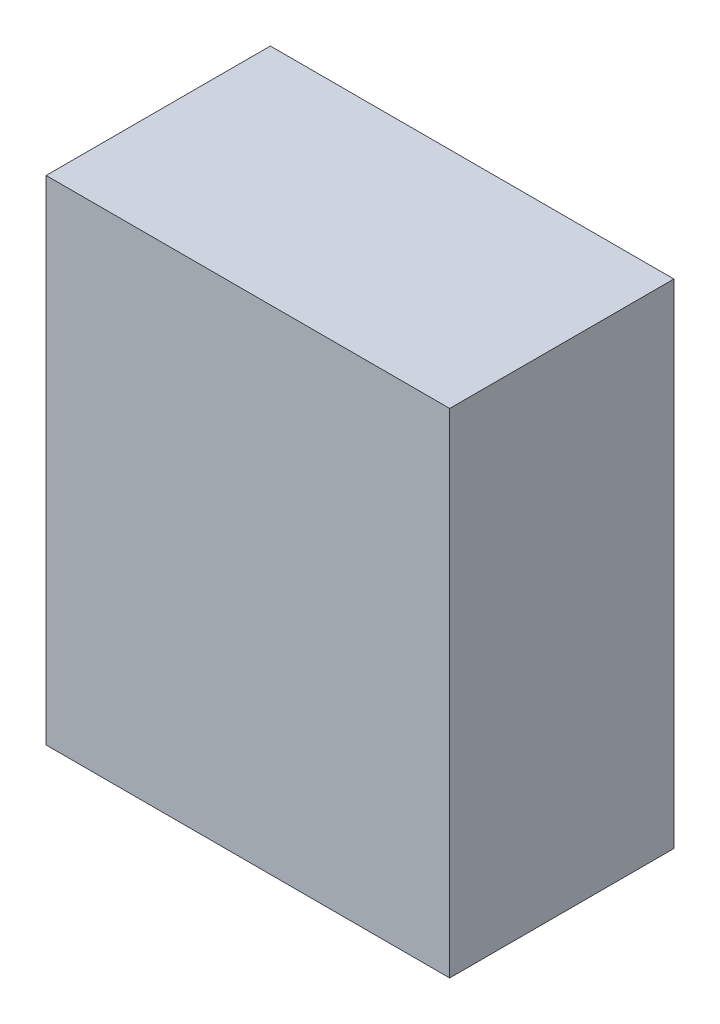
ISO-10303-21;
HEADER;
FILE_DESCRIPTION(('STEP AP214'),'2;1');
FILE_NAME('part.step','',(''),(''),'','','');
FILE_SCHEMA(('AUTOMOTIVE_DESIGN { 1 0 10303 214 1 1 1 1 }'));
ENDSEC;
DATA;
#1=APPLICATION_CONTEXT('core data for automotive mechanical design processes');
#2=APPLICATION_PROTOCOL_DEFINITION('international standard','automotive_design',2000,#1);
#3=PRODUCT_CONTEXT('',#1,'mechanical');
#4=PRODUCT('Part','Part','',(#3));
#5=PRODUCT_RELATED_PRODUCT_CATEGORY('part','',(#4));
#6=PRODUCT_DEFINITION_FORMATION('','',#4);
#7=PRODUCT_DEFINITION_CONTEXT('part definition',#1,'design');
#8=PRODUCT_DEFINITION('design','',#6,#7);
#9=PRODUCT_DEFINITION_SHAPE('','',#8);
#10=(LENGTH_UNIT() NAMED_UNIT(*) SI_UNIT(.MILLI.,.METRE.));
#11=(NAMED_UNIT(*) PLANE_ANGLE_UNIT() SI_UNIT($,.RADIAN.));
#12=(NAMED_UNIT(*) SI_UNIT($,.STERADIAN.) SOLID_ANGLE_UNIT());
#13=UNCERTAINTY_MEASURE_WITH_UNIT(LENGTH_MEASURE(1.E-05),#10,'distance_accuracy_value','');
#14=(GEOMETRIC_REPRESENTATION_CONTEXT(3) GLOBAL_UNCERTAINTY_ASSIGNED_CONTEXT((#13)) GLOBAL_UNIT_ASSIGNED_CONTEXT((#10,
#11,#12)) REPRESENTATION_CONTEXT('',''));
#15=CARTESIAN_POINT('',(0.,0.,0.));
#16=DIRECTION('',(0.,0.,1.));
#17=DIRECTION('',(1.,0.,0.));
#18=AXIS2_PLACEMENT_3D('',#15,#16,#17);
#19=CARTESIAN_POINT('',(-18.,22.,20.));
#20=DIRECTION('',(1.,0.,0.));
#21=DIRECTION('',(0.,1.,0.));
#22=AXIS2_PLACEMENT_3D('',#19,#20,#21);
#23=PLANE('',#22);
#24=DIRECTION('',(0.,-1.,0.));
#25=VECTOR('',#24,1.);
#26=CARTESIAN_POINT('',(-18.,22.,0.));
#27=LINE('',#26,#25);
#28=CARTESIAN_POINT('',(-18.,22.,0.));
#29=VERTEX_POINT('',#28);
#30=CARTESIAN_POINT('',(-18.,-22.,0.));
#31=VERTEX_POINT('',#30);
#32=EDGE_CURVE('E102',#29,#31,#27,.T.);
#33=ORIENTED_EDGE('',*,*,#32,.T.);
#34=DIRECTION('',(0.,0.,-1.));
#35=VECTOR('',#34,1.);
#36=CARTESIAN_POINT('',(-18.,-22.,20.));
#37=LINE('',#36,#35);
#38=CARTESIAN_POINT('',(-18.,-22.,20.));
#39=VERTEX_POINT('',#38);
#40=EDGE_CURVE('E11',#39,#31,#37,.T.);
#41=ORIENTED_EDGE('',*,*,#40,.F.);
#42=DIRECTION('',(0.,-1.,0.));
#43=VECTOR('',#42,1.);
#44=CARTESIAN_POINT('',(-18.,22.,20.));
#45=LINE('',#44,#43);
#46=CARTESIAN_POINT('',(-18.,22.,20.));
#47=VERTEX_POINT('',#46);
#48=EDGE_CURVE('E90',#47,#39,#45,.T.);
#49=ORIENTED_EDGE('',*,*,#48,.F.);
#50=DIRECTION('',(0.,0.,-1.));
#51=VECTOR('',#50,1.);
#52=CARTESIAN_POINT('',(-18.,22.,20.));
#53=LINE('',#52,#51);
#54=EDGE_CURVE('E98',#47,#29,#53,.T.);
#55=ORIENTED_EDGE('',*,*,#54,.T.);
#56=EDGE_LOOP('',(#33,#41,#49,#55));
#57=FACE_BOUND('',#56,.T.);
#58=ADVANCED_FACE('F39',(#57),#23,.F.);
#59=CARTESIAN_POINT('',(-18.,-22.,20.));
#60=DIRECTION('',(0.,1.,0.));
#61=DIRECTION('',(0.,0.,1.));
#62=AXIS2_PLACEMENT_3D('',#59,#60,#61);
#63=PLANE('',#62);
#64=DIRECTION('',(1.,0.,0.));
#65=VECTOR('',#64,1.);
#66=CARTESIAN_POINT('',(-18.,-22.,0.));
#67=LINE('',#66,#65);
#68=CARTESIAN_POINT('',(18.,-22.,0.));
#69=VERTEX_POINT('',#68);
#70=EDGE_CURVE('E94',#31,#69,#67,.T.);
#71=ORIENTED_EDGE('',*,*,#70,.T.);
#72=DIRECTION('',(0.,0.,-1.));
#73=VECTOR('',#72,1.);
#74=CARTESIAN_POINT('',(18.,-22.,20.));
#75=LINE('',#74,#73);
#76=CARTESIAN_POINT('',(18.,-22.,20.));
#77=VERTEX_POINT('',#76);
#78=EDGE_CURVE('E47',#77,#69,#75,.T.);
#79=ORIENTED_EDGE('',*,*,#78,.F.);
#80=DIRECTION('',(1.,0.,0.));
#81=VECTOR('',#80,1.);
#82=CARTESIAN_POINT('',(-18.,-22.,20.));
#83=LINE('',#82,#81);
#84=EDGE_CURVE('E85',#39,#77,#83,.T.);
#85=ORIENTED_EDGE('',*,*,#84,.F.);
#86=ORIENTED_EDGE('',*,*,#40,.T.);
#87=EDGE_LOOP('',(#71,#79,#85,#86));
#88=FACE_BOUND('',#87,.T.);
#89=ADVANCED_FACE('F93',(#88),#63,.F.);
#90=CARTESIAN_POINT('',(18.,22.,20.));
#91=DIRECTION('',(-1.,0.,0.));
#92=DIRECTION('',(0.,-1.,0.));
#93=AXIS2_PLACEMENT_3D('',#90,#91,#92);
#94=PLANE('',#93);
#95=DIRECTION('',(0.,1.,0.));
#96=VECTOR('',#95,1.);
#97=CARTESIAN_POINT('',(18.,22.,0.));
#98=LINE('',#97,#96);
#99=CARTESIAN_POINT('',(18.,22.,0.));
#100=VERTEX_POINT('',#99);
#101=EDGE_CURVE('E72',#69,#100,#98,.T.);
#102=ORIENTED_EDGE('',*,*,#101,.T.);
#103=DIRECTION('',(0.,0.,-1.));
#104=VECTOR('',#103,1.);
#105=CARTESIAN_POINT('',(18.,22.,20.));
#106=LINE('',#105,#104);
#107=CARTESIAN_POINT('',(18.,22.,20.));
#108=VERTEX_POINT('',#107);
#109=EDGE_CURVE('E95',#108,#100,#106,.T.);
#110=ORIENTED_EDGE('',*,*,#109,.F.);
#111=DIRECTION('',(0.,1.,0.));
#112=VECTOR('',#111,1.);
#113=CARTESIAN_POINT('',(18.,22.,20.));
#114=LINE('',#113,#112);
#115=EDGE_CURVE('E88',#77,#108,#114,.T.);
#116=ORIENTED_EDGE('',*,*,#115,.F.);
#117=ORIENTED_EDGE('',*,*,#78,.T.);
#118=EDGE_LOOP('',(#102,#110,#116,#117));
#119=FACE_BOUND('',#118,.T.);
#120=ADVANCED_FACE('F96',(#119),#94,.F.);
#121=CARTESIAN_POINT('',(-18.,22.,20.));
#122=DIRECTION('',(0.,-1.,0.));
#123=DIRECTION('',(0.,0.,-1.));
#124=AXIS2_PLACEMENT_3D('',#121,#122,#123);
#125=PLANE('',#124);
#126=DIRECTION('',(-1.,0.,0.));
#127=VECTOR('',#126,1.);
#128=CARTESIAN_POINT('',(-18.,22.,0.));
#129=LINE('',#128,#127);
#130=EDGE_CURVE('E78',#100,#29,#129,.T.);
#131=ORIENTED_EDGE('',*,*,#130,.T.);
#132=ORIENTED_EDGE('',*,*,#54,.F.);
#133=DIRECTION('',(-1.,0.,0.));
#134=VECTOR('',#133,1.);
#135=CARTESIAN_POINT('',(-18.,22.,20.));
#136=LINE('',#135,#134);
#137=EDGE_CURVE('E55',#108,#47,#136,.T.);
#138=ORIENTED_EDGE('',*,*,#137,.F.);
#139=ORIENTED_EDGE('',*,*,#109,.T.);
#140=EDGE_LOOP('',(#131,#132,#138,#139));
#141=FACE_BOUND('',#140,.T.);
#142=ADVANCED_FACE('F109',(#141),#125,.F.);
#143=CARTESIAN_POINT('',(0.,0.,20.));
#144=DIRECTION('',(0.,0.,1.));
#145=DIRECTION('',(1.,0.,0.));
#146=AXIS2_PLACEMENT_3D('',#143,#144,#145);
#147=PLANE('',#146);
#148=ORIENTED_EDGE('',*,*,#48,.T.);
#149=ORIENTED_EDGE('',*,*,#84,.T.);
#150=ORIENTED_EDGE('',*,*,#115,.T.);
#151=ORIENTED_EDGE('',*,*,#137,.T.);
#152=EDGE_LOOP('',(#148,#149,#150,#151));
#153=FACE_BOUND('',#152,.T.);
#154=ADVANCED_FACE('F86',(#153),#147,.T.);
#155=CARTESIAN_POINT('',(0.,0.,0.));
#156=DIRECTION('',(0.,0.,1.));
#157=DIRECTION('',(1.,0.,0.));
#158=AXIS2_PLACEMENT_3D('',#155,#156,#157);
#159=PLANE('',#158);
#160=ORIENTED_EDGE('',*,*,#32,.F.);
#161=ORIENTED_EDGE('',*,*,#130,.F.);
#162=ORIENTED_EDGE('',*,*,#101,.F.);
#163=ORIENTED_EDGE('',*,*,#70,.F.);
#164=EDGE_LOOP('',(#160,#161,#162,#163));
#165=FACE_BOUND('',#164,.T.);
#166=ADVANCED_FACE('F112',(#165),#159,.F.);
#167=CLOSED_SHELL('',(#58,#89,#120,#142,#154,#166));
#168=MANIFOLD_SOLID_BREP('B2',#167);
#169=ADVANCED_BREP_SHAPE_REPRESENTATION('',(#18,#168),#14);
#170=SHAPE_DEFINITION_REPRESENTATION(#9,#169);
ENDSEC;
END-ISO-10303-21;
